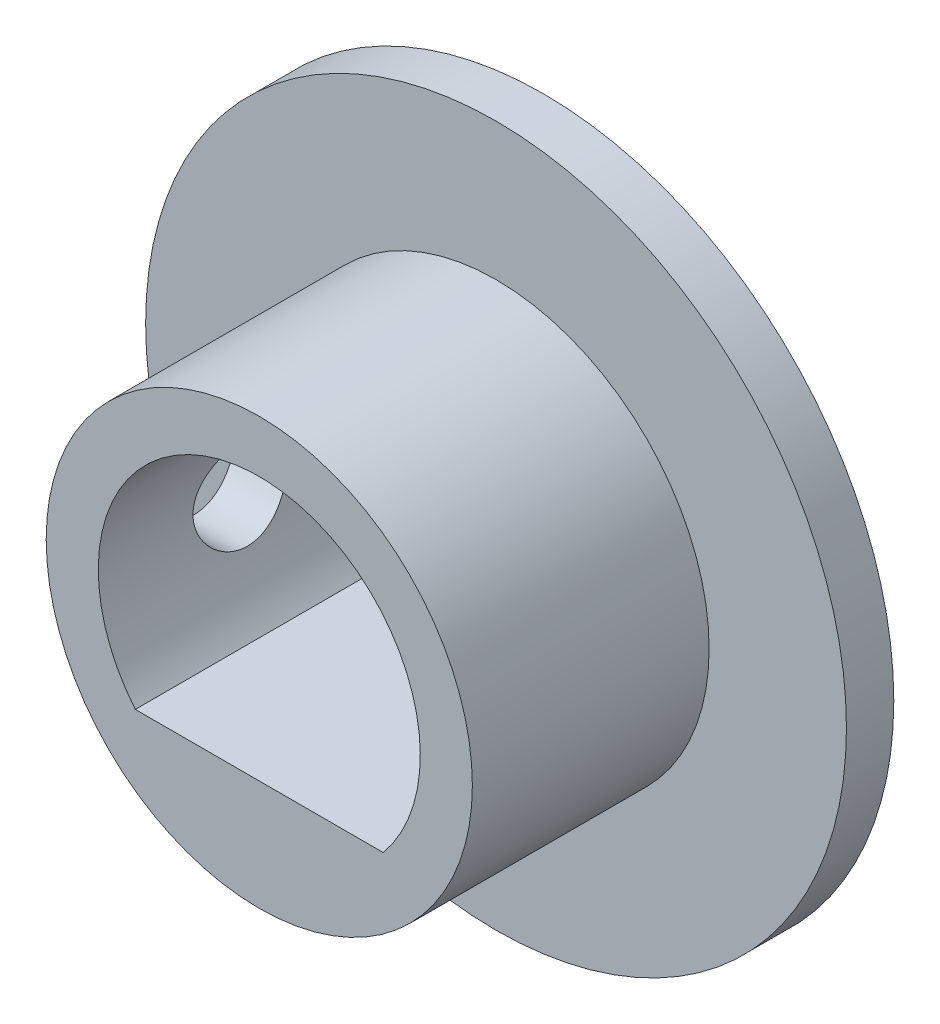
ISO-10303-21;
HEADER;
FILE_DESCRIPTION(('STEP AP214'),'2;1');
FILE_NAME('part.step','',(''),(''),'','','');
FILE_SCHEMA(('AUTOMOTIVE_DESIGN { 1 0 10303 214 1 1 1 1 }'));
ENDSEC;
DATA;
#1=APPLICATION_CONTEXT('core data for automotive mechanical design processes');
#2=APPLICATION_PROTOCOL_DEFINITION('international standard','automotive_design',2000,#1);
#3=PRODUCT_CONTEXT('',#1,'mechanical');
#4=PRODUCT('Part','Part','',(#3));
#5=PRODUCT_RELATED_PRODUCT_CATEGORY('part','',(#4));
#6=PRODUCT_DEFINITION_FORMATION('','',#4);
#7=PRODUCT_DEFINITION_CONTEXT('part definition',#1,'design');
#8=PRODUCT_DEFINITION('design','',#6,#7);
#9=PRODUCT_DEFINITION_SHAPE('','',#8);
#10=(LENGTH_UNIT() NAMED_UNIT(*) SI_UNIT(.MILLI.,.METRE.));
#11=(NAMED_UNIT(*) PLANE_ANGLE_UNIT() SI_UNIT($,.RADIAN.));
#12=(NAMED_UNIT(*) SI_UNIT($,.STERADIAN.) SOLID_ANGLE_UNIT());
#13=UNCERTAINTY_MEASURE_WITH_UNIT(LENGTH_MEASURE(1.E-05),#10,'distance_accuracy_value','');
#14=(GEOMETRIC_REPRESENTATION_CONTEXT(3) GLOBAL_UNCERTAINTY_ASSIGNED_CONTEXT((#13)) GLOBAL_UNIT_ASSIGNED_CONTEXT((#10,
#11,#12)) REPRESENTATION_CONTEXT('',''));
#15=CARTESIAN_POINT('',(0.,0.,0.));
#16=DIRECTION('',(0.,0.,1.));
#17=DIRECTION('',(1.,0.,0.));
#18=AXIS2_PLACEMENT_3D('',#15,#16,#17);
#19=CARTESIAN_POINT('',(-10.,0.,2.));
#20=DIRECTION('',(1.,0.,0.));
#21=DIRECTION('',(0.,0.,-1.));
#22=AXIS2_PLACEMENT_3D('',#19,#20,#21);
#23=CYLINDRICAL_SURFACE('',#22,0.5);
#24=CARTESIAN_POINT('',(-1.70000000000069,0.,1.5));
#25=CARTESIAN_POINT('',(-1.69999972396981,0.0274542175454998,1.50000039810855));
#26=CARTESIAN_POINT('',(-1.69932854758258,0.054912477704873,1.5022687167806));
#27=CARTESIAN_POINT('',(-1.69671658618526,0.109030958051796,1.51126154207209));
#28=CARTESIAN_POINT('',(-1.69477538023207,0.135690910580581,1.51798752616556));
#29=CARTESIAN_POINT('',(-1.68983635138412,0.187424279484835,1.53565283018592));
#30=CARTESIAN_POINT('',(-1.68684005234762,0.212499922780447,1.54658607571816));
#31=CARTESIAN_POINT('',(-1.68010321919066,0.260462027591253,1.57233107143137));
#32=CARTESIAN_POINT('',(-1.67636259475988,0.28334822295742,1.58714329232425));
#33=CARTESIAN_POINT('',(-1.6684211212758,0.326915832232665,1.62065834848709));
#34=CARTESIAN_POINT('',(-1.66421111945033,0.347528005838767,1.63944901914893));
#35=CARTESIAN_POINT('',(-1.65586072964249,0.385358695625953,1.68020027505933));
#36=CARTESIAN_POINT('',(-1.65172035292767,0.402576667261324,1.70216136797423));
#37=CARTESIAN_POINT('',(-1.64388177885663,0.433489560843398,1.74920978849644));
#38=CARTESIAN_POINT('',(-1.64019498875948,0.447100870925724,1.77435413117266));
#39=CARTESIAN_POINT('',(-1.63381741309155,0.469873934282045,1.82670075125634));
#40=CARTESIAN_POINT('',(-1.63112639884003,0.479036709316839,1.85390255443589));
#41=CARTESIAN_POINT('',(-1.62714028106143,0.492404618093305,1.90881628430084));
#42=CARTESIAN_POINT('',(-1.62580942222055,0.496737026528988,1.93649456404589));
#43=CARTESIAN_POINT('',(-1.62458784321419,0.500718547717908,1.99221464004671));
#44=CARTESIAN_POINT('',(-1.6246967892879,0.500368745852888,2.02025635055003));
#45=CARTESIAN_POINT('',(-1.62631076423464,0.495095940847221,2.07488018833094));
#46=CARTESIAN_POINT('',(-1.62776743003588,0.490331354004492,2.10147927130698));
#47=CARTESIAN_POINT('',(-1.63183462131941,0.476619765951321,2.15348255261052));
#48=CARTESIAN_POINT('',(-1.6344452566834,0.46767236644609,2.17888663689454));
#49=CARTESIAN_POINT('',(-1.64056554249258,0.445730211204775,2.22817092913304));
#50=CARTESIAN_POINT('',(-1.64408666355708,0.432683320772064,2.25202644070068));
#51=CARTESIAN_POINT('',(-1.6516255465502,0.402948792079227,2.29726307507329));
#52=CARTESIAN_POINT('',(-1.6556434246939,0.386260301174661,2.31864361659134));
#53=CARTESIAN_POINT('',(-1.66392021053814,0.348925235082879,2.35922317345253));
#54=CARTESIAN_POINT('',(-1.66818232641238,0.328146894888292,2.37830050623496));
#55=CARTESIAN_POINT('',(-1.67632443382187,0.28363291087304,2.41272760278791));
#56=CARTESIAN_POINT('',(-1.68020440312332,0.259897095164163,2.42807714974681));
#57=CARTESIAN_POINT('',(-1.68717818213053,0.209926848756554,2.45468300398081));
#58=CARTESIAN_POINT('',(-1.69026694822818,0.183677785505987,2.4659132390462));
#59=CARTESIAN_POINT('',(-1.69527396107227,0.129551766537361,2.48376420514398));
#60=CARTESIAN_POINT('',(-1.6971925211271,0.101675248742461,2.49038617005146));
#61=CARTESIAN_POINT('',(-1.69959379405195,0.0461208137740008,2.49863217783922));
#62=CARTESIAN_POINT('',(-1.7001238920488,0.0184693998456999,2.50042122697516));
#63=CARTESIAN_POINT('',(-1.69982701770587,-0.0367399044955548,2.49941185344966));
#64=CARTESIAN_POINT('',(-1.69900021882993,-0.0642978064116669,2.49661401716943));
#65=CARTESIAN_POINT('',(-1.69611340455512,-0.117921271346877,2.48664411114999));
#66=CARTESIAN_POINT('',(-1.69408036196296,-0.144006199434007,2.47956765159767));
#67=CARTESIAN_POINT('',(-1.68901536343125,-0.194613518045656,2.46135566461608));
#68=CARTESIAN_POINT('',(-1.68598328919923,-0.219135723122082,2.4502196564907));
#69=CARTESIAN_POINT('',(-1.67915033525374,-0.266534944942125,2.4239224202686));
#70=CARTESIAN_POINT('',(-1.6753336735366,-0.289362448535129,2.40867615717212));
#71=CARTESIAN_POINT('',(-1.66737041365817,-0.332191560315024,2.37469515596717));
#72=CARTESIAN_POINT('',(-1.66322373609983,-0.352192485235586,2.35595957691774));
#73=CARTESIAN_POINT('',(-1.65488725580275,-0.389521688003129,2.31475718567328));
#74=CARTESIAN_POINT('',(-1.65070097598705,-0.406732704570867,2.29218319744675));
#75=CARTESIAN_POINT('',(-1.64291353562876,-0.437129517026455,2.24437672555393));
#76=CARTESIAN_POINT('',(-1.63931235745109,-0.450315434242085,2.21914432205058));
#77=CARTESIAN_POINT('',(-1.63314467441339,-0.472194711731598,2.16682854432189));
#78=CARTESIAN_POINT('',(-1.6305730587306,-0.480910325161373,2.13975511367299));
#79=CARTESIAN_POINT('',(-1.62676658509109,-0.49363492715321,2.08443576832728));
#80=CARTESIAN_POINT('',(-1.62553129148333,-0.497645449646345,2.05619023886352));
#81=CARTESIAN_POINT('',(-1.62457908151666,-0.500744547640744,2.00054324812884));
#82=CARTESIAN_POINT('',(-1.6248033563012,-0.500023747013505,1.9731532671098));
#83=CARTESIAN_POINT('',(-1.62660429813584,-0.494133317252603,1.91890354609242));
#84=CARTESIAN_POINT('',(-1.62818091489141,-0.488963853567801,1.89204378641279));
#85=CARTESIAN_POINT('',(-1.63247022811412,-0.474443717982469,1.83991528209132));
#86=CARTESIAN_POINT('',(-1.63516969306,-0.465141659938631,1.81463182780227));
#87=CARTESIAN_POINT('',(-1.64139857101321,-0.442658103895199,1.76596432278144));
#88=CARTESIAN_POINT('',(-1.64492813798754,-0.42947588609091,1.74258062549968));
#89=CARTESIAN_POINT('',(-1.65257448134245,-0.399063021174092,1.69748709178552));
#90=CARTESIAN_POINT('',(-1.65670754358588,-0.381706300583875,1.6758650444223));
#91=CARTESIAN_POINT('',(-1.66501406548957,-0.343666397752522,1.63577861717299));
#92=CARTESIAN_POINT('',(-1.66918753523427,-0.322982363900053,1.61731504818874));
#93=CARTESIAN_POINT('',(-1.67724327840533,-0.278184131205535,1.58356079177661));
#94=CARTESIAN_POINT('',(-1.68111427331445,-0.253990743219957,1.56837224133486));
#95=CARTESIAN_POINT('',(-1.68799593333913,-0.203279874238697,1.54230015692986));
#96=CARTESIAN_POINT('',(-1.69100702921778,-0.176763565631545,1.53141446641206));
#97=CARTESIAN_POINT('',(-1.6955429771066,-0.125377523319693,1.51531644916826));
#98=CARTESIAN_POINT('',(-1.69720086024169,-0.100680227815031,1.50958791513499));
#99=CARTESIAN_POINT('',(-1.69942941608043,-0.0506563708688417,1.50192979672589));
#100=CARTESIAN_POINT('',(-1.70000025467326,-0.0253299060398251,1.4999996326957));
#101=CARTESIAN_POINT('',(-1.70000000000069,0.,1.5));
#102=B_SPLINE_CURVE_WITH_KNOTS('',3,(#24,#25,#26,#27,#28,#29,#30,#31,#32,#33,#34,#35,#36,#37,
#38,#39,#40,#41,#42,#43,#44,#45,#46,#47,#48,#49,#50,#51,#52,#53,#54,#55,#56,#57,#58,#59,#60,#61,
#62,#63,#64,#65,#66,#67,#68,#69,#70,#71,#72,#73,#74,#75,#76,#77,#78,#79,#80,#81,#82,#83,#84,#85,
#86,#87,#88,#89,#90,#91,#92,#93,#94,#95,#96,#97,#98,#99,#100,#101),.UNSPECIFIED.,.T.,.F.,(4,2,2,
2,2,2,2,2,2,2,2,2,2,2,2,2,2,2,2,2,2,2,2,2,2,2,2,2,2,2,2,2,2,2,2,2,2,2,4),(0.,0.0822696384189309,
0.16456655840143,0.246745102176107,0.328933622904903,0.41317236146188,0.497424603805164,
0.583486437069727,0.669528493878357,0.753245524854036,0.836943149746451,0.917749119380957,
0.998562785070003,1.08044888740713,1.1623541831705,1.24754016451814,1.33273109917883,
1.418452287519,1.50415051497112,1.58688347605599,1.66960586149594,1.75054473049358,
1.83149318667638,1.91426539874687,1.99705758517075,2.08273157599064,2.1684029841012,
2.25364367704803,2.33885657250566,2.42065793646578,2.50245625830796,2.58331682330487,
2.66419239813121,2.74791225511781,2.83165357403022,2.91771614907322,3.00373553547224,
3.07965102255304,3.15555492357038),.UNSPECIFIED.);
#103=CARTESIAN_POINT('',(-1.70000000000069,0.,1.5));
#104=VERTEX_POINT('',#103);
#105=EDGE_CURVE('E66',#104,#104,#102,.T.);
#106=ORIENTED_EDGE('',*,*,#105,.T.);
#107=EDGE_LOOP('',(#106));
#108=FACE_BOUND('',#107,.T.);
#109=CARTESIAN_POINT('',(-2.25,0.,1.5));
#110=CARTESIAN_POINT('',(-2.24999949054563,0.0277201191939123,1.50000093091996));
#111=CARTESIAN_POINT('',(-2.24948253498923,0.0554513913174053,1.50231299541588));
#112=CARTESIAN_POINT('',(-2.24747024439417,0.110125486025784,1.51149011808764));
#113=CARTESIAN_POINT('',(-2.24597422554337,0.137067743784747,1.51835835850232));
#114=CARTESIAN_POINT('',(-2.24217028292252,0.189365819440382,1.53642149262292));
#115=CARTESIAN_POINT('',(-2.23986322109771,0.214723288025071,1.54761179424947));
#116=CARTESIAN_POINT('',(-2.23468583860344,0.263200045078441,1.57398665311811));
#117=CARTESIAN_POINT('',(-2.2318155288684,0.286319376983337,1.58917113282266));
#118=CARTESIAN_POINT('',(-2.22577273543553,0.330046578503509,1.62336891627667));
#119=CARTESIAN_POINT('',(-2.22259640410357,0.350612153010884,1.64243562553379));
#120=CARTESIAN_POINT('',(-2.21632650269947,0.388281227614593,1.68374201502329));
#121=CARTESIAN_POINT('',(-2.21323294022012,0.405384411027139,1.70598198517762));
#122=CARTESIAN_POINT('',(-2.20744082065428,0.435831108525876,1.75331796101458));
#123=CARTESIAN_POINT('',(-2.20474718935745,0.449129355261009,1.77844373951039));
#124=CARTESIAN_POINT('',(-2.20011524088099,0.471298247386271,1.83064319042311));
#125=CARTESIAN_POINT('',(-2.19817683026193,0.48016944055024,1.85771662137607));
#126=CARTESIAN_POINT('',(-2.19531402364797,0.493092145016011,1.91258336933067));
#127=CARTESIAN_POINT('',(-2.19437386451946,0.497218667595172,1.94035817877636));
#128=CARTESIAN_POINT('',(-2.19356668432667,0.500768177494183,1.99622055444655));
#129=CARTESIAN_POINT('',(-2.19369952694735,0.500191762279158,2.02430808049054));
#130=CARTESIAN_POINT('',(-2.19500908037036,0.494412068793255,2.07943915679845));
#131=CARTESIAN_POINT('',(-2.1961660784621,0.489296161150543,2.10649240603484));
#132=CARTESIAN_POINT('',(-2.19936238547919,0.474721226702865,2.15934678583125));
#133=CARTESIAN_POINT('',(-2.20140174533294,0.465261949204129,2.18514784402135));
#134=CARTESIAN_POINT('',(-2.20615227492574,0.442189182182187,2.23500985959547));
#135=CARTESIAN_POINT('',(-2.20886881090622,0.428542298448382,2.25905483183402));
#136=CARTESIAN_POINT('',(-2.21466434477686,0.397505170349624,2.30454571762898));
#137=CARTESIAN_POINT('',(-2.21774339355149,0.380114400185686,2.32599126545504));
#138=CARTESIAN_POINT('',(-2.22400143653166,0.341621709257457,2.36617732733712));
#139=CARTESIAN_POINT('',(-2.22718112671968,0.320445551316558,2.38484669627627));
#140=CARTESIAN_POINT('',(-2.23321959780579,0.275226654522905,2.41838093222678));
#141=CARTESIAN_POINT('',(-2.23607837252107,0.251183860459343,2.43324572594548));
#142=CARTESIAN_POINT('',(-2.24116266058402,0.200825797683684,2.45876731894421));
#143=CARTESIAN_POINT('',(-2.24338673251915,0.174505530579964,2.46941456107707));
#144=CARTESIAN_POINT('',(-2.24694034091564,0.120388982745364,2.48611525326447));
#145=CARTESIAN_POINT('',(-2.24827001174196,0.0925929243983415,2.49216939335354));
#146=CARTESIAN_POINT('',(-2.24986579440418,0.0369238708202113,2.4994080033138));
#147=CARTESIAN_POINT('',(-2.25015312155572,0.00906409932972637,2.50068962504042));
#148=CARTESIAN_POINT('',(-2.24969139662649,-0.0464714809820199,2.49861047393491));
#149=CARTESIAN_POINT('',(-2.24894241722615,-0.0741473025676614,2.49525002667014));
#150=CARTESIAN_POINT('',(-2.24650564689653,-0.128205814332355,2.48406264620798));
#151=CARTESIAN_POINT('',(-2.2448286175194,-0.154599622928871,2.47628688594414));
#152=CARTESIAN_POINT('',(-2.24072355271699,-0.205708201463958,2.45654657813874));
#153=CARTESIAN_POINT('',(-2.23829545191165,-0.230422825002544,2.4445816659235));
#154=CARTESIAN_POINT('',(-2.2329053830691,-0.277871609973595,2.41660178080026));
#155=CARTESIAN_POINT('',(-2.22993611147562,-0.300571432708062,2.40053001424846));
#156=CARTESIAN_POINT('',(-2.2238075808727,-0.34298674124703,2.36486718772464));
#157=CARTESIAN_POINT('',(-2.22064829637544,-0.362701825433532,2.34527565491698));
#158=CARTESIAN_POINT('',(-2.21442219736453,-0.398973870477464,2.30268299160483));
#159=CARTESIAN_POINT('',(-2.21135829416071,-0.415463454850183,2.27962397749835));
#160=CARTESIAN_POINT('',(-2.20573848844577,-0.44433652980688,2.2310069913973));
#161=CARTESIAN_POINT('',(-2.20318256373818,-0.456720199817434,2.20544912866448));
#162=CARTESIAN_POINT('',(-2.19889300137232,-0.476945004740648,2.15269792772372));
#163=CARTESIAN_POINT('',(-2.19715469914947,-0.484811965886897,2.12551488943279));
#164=CARTESIAN_POINT('',(-2.19468912424348,-0.495855069146014,2.07016895378439));
#165=CARTESIAN_POINT('',(-2.19396168386833,-0.49903198929589,2.04200621974352));
#166=CARTESIAN_POINT('',(-2.19361100362244,-0.50057089160261,1.98618028043042));
#167=CARTESIAN_POINT('',(-2.19396324592531,-0.499039782859833,1.95852012298499));
#168=CARTESIAN_POINT('',(-2.19567666239387,-0.491445692804219,1.9038625725083));
#169=CARTESIAN_POINT('',(-2.19703782386758,-0.485382768500599,1.87686517114413));
#170=CARTESIAN_POINT('',(-2.20060357032881,-0.468949549951861,1.82438771994316));
#171=CARTESIAN_POINT('',(-2.20280501295692,-0.458595291571134,1.7989024207796));
#172=CARTESIAN_POINT('',(-2.20780441117264,-0.433886925870855,1.75001500186332));
#173=CARTESIAN_POINT('',(-2.21060243119158,-0.419532386462984,1.726613107509));
#174=CARTESIAN_POINT('',(-2.21655260708832,-0.386878397476395,1.68203084776301));
#175=CARTESIAN_POINT('',(-2.21971092841935,-0.368502963777596,1.66090694876934));
#176=CARTESIAN_POINT('',(-2.22598493543347,-0.32848217648626,1.62200748151717));
#177=CARTESIAN_POINT('',(-2.22910061107263,-0.306836066558359,1.6042326898729));
#178=CARTESIAN_POINT('',(-2.23498814931645,-0.260536492661392,1.57230600427002));
#179=CARTESIAN_POINT('',(-2.23775480874807,-0.235846409158737,1.55820620006627));
#180=CARTESIAN_POINT('',(-2.24258014592312,-0.184390069944705,1.5343791739547));
#181=CARTESIAN_POINT('',(-2.24463940817704,-0.157625550828249,1.52464833998846));
#182=CARTESIAN_POINT('',(-2.24745703227389,-0.109034561932352,1.51153966243081));
#183=CARTESIAN_POINT('',(-2.24840467255803,-0.0874679979754205,1.50722065658343));
#184=CARTESIAN_POINT('',(-2.24967634364947,-0.0439366124736319,1.50145052392347));
#185=CARTESIAN_POINT('',(-2.25000040380903,-0.0219718097232194,1.49999926212453));
#186=CARTESIAN_POINT('',(-2.25,0.,1.5));
#187=B_SPLINE_CURVE_WITH_KNOTS('',3,(#109,#110,#111,#112,#113,#114,#115,#116,#117,#118,#119,
#120,#121,#122,#123,#124,#125,#126,#127,#128,#129,#130,#131,#132,#133,#134,#135,#136,#137,#138,
#139,#140,#141,#142,#143,#144,#145,#146,#147,#148,#149,#150,#151,#152,#153,#154,#155,#156,#157,
#158,#159,#160,#161,#162,#163,#164,#165,#166,#167,#168,#169,#170,#171,#172,#173,#174,#175,#176,
#177,#178,#179,#180,#181,#182,#183,#184,#185,#186),.UNSPECIFIED.,.T.,.F.,(4,2,2,2,2,2,2,2,2,2,2,
2,2,2,2,2,2,2,2,2,2,2,2,2,2,2,2,2,2,2,2,2,2,2,2,2,2,2,4),(0.,0.0830799224324492,
0.166217932812321,0.249267853101865,0.332316161292473,0.416595180005198,0.500881903726285,
0.58613324074494,0.67137402671935,0.755247814095267,0.839110946241477,0.921394170364459,
1.00368214436735,1.08664417427395,1.16961786314575,1.25444544952244,1.33927466992457,
1.42429503202809,1.50930261875497,1.59256998031067,1.67583150228067,1.75814717356292,
1.84047001236365,1.9239995081551,2.00754023346939,2.09267368276432,2.17780341127603,
2.26244139763811,2.34706534171603,2.42978196285604,2.51249754345715,2.59490678003945,
2.67732492146596,2.76146081578206,2.84561619616603,2.93090646762392,3.01612609467734,
3.08198086839639,3.14783254221988),.UNSPECIFIED.);
#188=CARTESIAN_POINT('',(-2.25,0.,1.5));
#189=VERTEX_POINT('',#188);
#190=EDGE_CURVE('E103',#189,#189,#187,.T.);
#191=ORIENTED_EDGE('',*,*,#190,.F.);
#192=EDGE_LOOP('',(#191));
#193=FACE_BOUND('',#192,.T.);
#194=ADVANCED_FACE('F36',(#108,#193),#23,.F.);
#195=CARTESIAN_POINT('',(0.,0.,6.5));
#196=DIRECTION('',(0.,0.,-1.));
#197=DIRECTION('',(-1.,0.,0.));
#198=AXIS2_PLACEMENT_3D('',#195,#196,#197);
#199=CYLINDRICAL_SURFACE('',#198,3.7);
#200=CARTESIAN_POINT('',(0.,0.,1.));
#201=DIRECTION('',(0.,0.,1.));
#202=DIRECTION('',(1.,0.,0.));
#203=AXIS2_PLACEMENT_3D('',#200,#201,#202);
#204=CIRCLE('',#203,3.7);
#205=CARTESIAN_POINT('',(-3.7,0.,0.999999999999999));
#206=VERTEX_POINT('',#205);
#207=EDGE_CURVE('E110',#206,#206,#204,.T.);
#208=CARTESIAN_POINT('',(0.,0.,0.5));
#209=DIRECTION('',(0.,0.,-1.));
#210=DIRECTION('',(-1.,0.,0.));
#211=AXIS2_PLACEMENT_3D('',#208,#209,#210);
#212=CIRCLE('',#211,3.7);
#213=CARTESIAN_POINT('',(-3.7,0.,0.5));
#214=VERTEX_POINT('',#213);
#215=EDGE_CURVE('E109',#214,#214,#212,.T.);
#216=CARTESIAN_POINT('',(-3.7,0.,0.999999999999999));
#217=CARTESIAN_POINT('',(-3.7,0.,0.994791666666666));
#218=CARTESIAN_POINT('',(-3.7,0.,0.989583333333333));
#219=CARTESIAN_POINT('',(-3.7,0.,0.979166666666666));
#220=CARTESIAN_POINT('',(-3.7,0.,0.973958333333332));
#221=CARTESIAN_POINT('',(-3.7,0.,0.963541666666666));
#222=CARTESIAN_POINT('',(-3.7,0.,0.958333333333332));
#223=CARTESIAN_POINT('',(-3.7,0.,0.947916666666666));
#224=CARTESIAN_POINT('',(-3.7,0.,0.942708333333332));
#225=CARTESIAN_POINT('',(-3.7,0.,0.932291666666666));
#226=CARTESIAN_POINT('',(-3.7,0.,0.927083333333332));
#227=CARTESIAN_POINT('',(-3.7,0.,0.916666666666666));
#228=CARTESIAN_POINT('',(-3.7,0.,0.911458333333332));
#229=CARTESIAN_POINT('',(-3.7,0.,0.901041666666666));
#230=CARTESIAN_POINT('',(-3.7,0.,0.895833333333332));
#231=CARTESIAN_POINT('',(-3.7,0.,0.885416666666666));
#232=CARTESIAN_POINT('',(-3.7,0.,0.880208333333332));
#233=CARTESIAN_POINT('',(-3.7,0.,0.869791666666666));
#234=CARTESIAN_POINT('',(-3.7,0.,0.864583333333333));
#235=CARTESIAN_POINT('',(-3.7,0.,0.854166666666667));
#236=CARTESIAN_POINT('',(-3.7,0.,0.848958333333333));
#237=CARTESIAN_POINT('',(-3.7,0.,0.838541666666667));
#238=CARTESIAN_POINT('',(-3.7,0.,0.833333333333333));
#239=CARTESIAN_POINT('',(-3.7,0.,0.822916666666667));
#240=CARTESIAN_POINT('',(-3.7,0.,0.817708333333333));
#241=CARTESIAN_POINT('',(-3.7,0.,0.807291666666667));
#242=CARTESIAN_POINT('',(-3.7,0.,0.802083333333333));
#243=CARTESIAN_POINT('',(-3.7,0.,0.791666666666667));
#244=CARTESIAN_POINT('',(-3.7,0.,0.786458333333333));
#245=CARTESIAN_POINT('',(-3.7,0.,0.776041666666667));
#246=CARTESIAN_POINT('',(-3.7,0.,0.770833333333333));
#247=CARTESIAN_POINT('',(-3.7,0.,0.760416666666667));
#248=CARTESIAN_POINT('',(-3.7,0.,0.755208333333333));
#249=CARTESIAN_POINT('',(-3.7,0.,0.744791666666667));
#250=CARTESIAN_POINT('',(-3.7,0.,0.739583333333333));
#251=CARTESIAN_POINT('',(-3.7,0.,0.729166666666667));
#252=CARTESIAN_POINT('',(-3.7,0.,0.723958333333333));
#253=CARTESIAN_POINT('',(-3.7,0.,0.713541666666667));
#254=CARTESIAN_POINT('',(-3.7,0.,0.708333333333333));
#255=CARTESIAN_POINT('',(-3.7,0.,0.697916666666666));
#256=CARTESIAN_POINT('',(-3.7,0.,0.692708333333333));
#257=CARTESIAN_POINT('',(-3.7,0.,0.682291666666666));
#258=CARTESIAN_POINT('',(-3.7,0.,0.677083333333333));
#259=CARTESIAN_POINT('',(-3.7,0.,0.666666666666666));
#260=CARTESIAN_POINT('',(-3.7,0.,0.661458333333333));
#261=CARTESIAN_POINT('',(-3.7,0.,0.651041666666666));
#262=CARTESIAN_POINT('',(-3.7,0.,0.645833333333333));
#263=CARTESIAN_POINT('',(-3.7,0.,0.635416666666667));
#264=CARTESIAN_POINT('',(-3.7,0.,0.630208333333334));
#265=CARTESIAN_POINT('',(-3.7,0.,0.619791666666667));
#266=CARTESIAN_POINT('',(-3.7,0.,0.614583333333334));
#267=CARTESIAN_POINT('',(-3.7,0.,0.604166666666667));
#268=CARTESIAN_POINT('',(-3.7,0.,0.598958333333334));
#269=CARTESIAN_POINT('',(-3.7,0.,0.588541666666667));
#270=CARTESIAN_POINT('',(-3.7,0.,0.583333333333334));
#271=CARTESIAN_POINT('',(-3.7,0.,0.572916666666667));
#272=CARTESIAN_POINT('',(-3.7,0.,0.567708333333334));
#273=CARTESIAN_POINT('',(-3.7,0.,0.557291666666667));
#274=CARTESIAN_POINT('',(-3.7,0.,0.552083333333334));
#275=CARTESIAN_POINT('',(-3.7,0.,0.541666666666667));
#276=CARTESIAN_POINT('',(-3.7,0.,0.536458333333334));
#277=CARTESIAN_POINT('',(-3.7,0.,0.526041666666667));
#278=CARTESIAN_POINT('',(-3.7,0.,0.520833333333334));
#279=CARTESIAN_POINT('',(-3.7,0.,0.510416666666667));
#280=CARTESIAN_POINT('',(-3.7,0.,0.505208333333334));
#281=CARTESIAN_POINT('',(-3.7,0.,0.5));
#282=B_SPLINE_CURVE_WITH_KNOTS('',3,(#216,#217,#218,#219,#220,#221,#222,#223,#224,#225,#226,
#227,#228,#229,#230,#231,#232,#233,#234,#235,#236,#237,#238,#239,#240,#241,#242,#243,#244,#245,
#246,#247,#248,#249,#250,#251,#252,#253,#254,#255,#256,#257,#258,#259,#260,#261,#262,#263,#264,
#265,#266,#267,#268,#269,#270,#271,#272,#273,#274,#275,#276,#277,#278,#279,#280,#281),
.UNSPECIFIED.,.F.,.F.,(4,2,2,2,2,2,2,2,2,2,2,2,2,2,2,2,2,2,2,2,2,2,2,2,2,2,2,2,2,2,2,2,4),(0.,
0.015625,0.03125,0.046875,0.0625000000000001,0.0781250000000001,0.0937500000000001,0.109375,
0.125,0.140624999999999,0.156249999999999,0.171874999999999,0.187499999999999,0.203124999999999,
0.218749999999999,0.234374999999999,0.249999999999999,0.265624999999999,0.281249999999999,
0.296874999999999,0.312499999999999,0.328124999999999,0.343749999999999,0.359374999999999,
0.374999999999999,0.390624999999999,0.406249999999999,0.421874999999999,0.437499999999999,
0.453124999999999,0.468749999999999,0.484374999999999,0.499999999999999),.UNSPECIFIED.);
#283=EDGE_CURVE('BSEAM38',#206,#214,#282,.T.);
#284=ORIENTED_EDGE('',*,*,#207,.F.);
#285=ORIENTED_EDGE('',*,*,#215,.F.);
#286=ORIENTED_EDGE('',*,*,#283,.T.);
#287=ORIENTED_EDGE('',*,*,#283,.F.);
#288=EDGE_LOOP('',(#284,#286,#285,#287));
#289=FACE_BOUND('',#288,.T.);
#290=ADVANCED_FACE('F38',(#289),#199,.T.);
#291=CARTESIAN_POINT('',(0.,0.,1.));
#292=DIRECTION('',(0.,0.,1.));
#293=DIRECTION('',(1.,0.,0.));
#294=AXIS2_PLACEMENT_3D('',#291,#292,#293);
#295=PLANE('',#294);
#296=ORIENTED_EDGE('',*,*,#207,.T.);
#297=EDGE_LOOP('',(#296));
#298=FACE_BOUND('',#297,.T.);
#299=CARTESIAN_POINT('',(0.,0.,1.));
#300=DIRECTION('',(0.,0.,1.));
#301=DIRECTION('',(1.,0.,0.));
#302=AXIS2_PLACEMENT_3D('',#299,#300,#301);
#303=CIRCLE('',#302,2.25);
#304=CARTESIAN_POINT('',(2.25,0.,1.));
#305=VERTEX_POINT('',#304);
#306=EDGE_CURVE('E86',#305,#305,#303,.F.);
#307=ORIENTED_EDGE('',*,*,#306,.T.);
#308=EDGE_LOOP('',(#307));
#309=FACE_BOUND('',#308,.T.);
#310=ADVANCED_FACE('F119',(#298,#309),#295,.T.);
#311=CARTESIAN_POINT('',(0.,0.,0.5));
#312=DIRECTION('',(0.,0.,-1.));
#313=DIRECTION('',(-1.,0.,0.));
#314=AXIS2_PLACEMENT_3D('',#311,#312,#313);
#315=PLANE('',#314);
#316=CARTESIAN_POINT('',(0.,0.,0.5));
#317=DIRECTION('',(0.,0.,-1.));
#318=DIRECTION('',(-1.,0.,0.));
#319=AXIS2_PLACEMENT_3D('',#316,#317,#318);
#320=CIRCLE('',#319,1.70000000000069);
#321=CARTESIAN_POINT('',(-1.30904906991983,-1.08461538461538,0.5));
#322=VERTEX_POINT('',#321);
#323=CARTESIAN_POINT('',(1.30904906991983,-1.08461538461538,0.5));
#324=VERTEX_POINT('',#323);
#325=EDGE_CURVE('E51',#322,#324,#320,.T.);
#326=ORIENTED_EDGE('',*,*,#325,.F.);
#327=DIRECTION('',(-1.,0.,0.));
#328=VECTOR('',#327,1.);
#329=CARTESIAN_POINT('',(1.30904906991983,-1.08461538461538,0.5));
#330=LINE('',#329,#328);
#331=EDGE_CURVE('E70',#324,#322,#330,.T.);
#332=ORIENTED_EDGE('',*,*,#331,.F.);
#333=EDGE_LOOP('',(#326,#332));
#334=FACE_BOUND('',#333,.T.);
#335=ORIENTED_EDGE('',*,*,#215,.T.);
#336=EDGE_LOOP('',(#335));
#337=FACE_BOUND('',#336,.T.);
#338=ADVANCED_FACE('F74',(#334,#337),#315,.T.);
#339=CARTESIAN_POINT('',(0.,0.,-6.4953318805774));
#340=DIRECTION('',(0.,0.,1.));
#341=DIRECTION('',(1.,0.,0.));
#342=AXIS2_PLACEMENT_3D('',#339,#340,#341);
#343=CYLINDRICAL_SURFACE('',#342,2.25);
#344=CARTESIAN_POINT('',(0.,0.,3.5));
#345=DIRECTION('',(0.,0.,-1.));
#346=DIRECTION('',(-1.,0.,0.));
#347=AXIS2_PLACEMENT_3D('',#344,#345,#346);
#348=CIRCLE('',#347,2.25);
#349=CARTESIAN_POINT('',(-2.25,0.,3.5));
#350=VERTEX_POINT('',#349);
#351=EDGE_CURVE('E85',#350,#350,#348,.F.);
#352=ORIENTED_EDGE('',*,*,#351,.F.);
#353=EDGE_LOOP('',(#352));
#354=FACE_BOUND('',#353,.T.);
#355=ORIENTED_EDGE('',*,*,#306,.F.);
#356=EDGE_LOOP('',(#355));
#357=FACE_BOUND('',#356,.T.);
#358=ORIENTED_EDGE('',*,*,#190,.T.);
#359=EDGE_LOOP('',(#358));
#360=FACE_BOUND('',#359,.T.);
#361=ADVANCED_FACE('F97',(#354,#357,#360),#343,.T.);
#362=CARTESIAN_POINT('',(-5.,-3.30057286981229,3.5));
#363=DIRECTION('',(0.,0.,-1.));
#364=DIRECTION('',(-1.,0.,0.));
#365=AXIS2_PLACEMENT_3D('',#362,#363,#364);
#366=PLANE('',#365);
#367=DIRECTION('',(-1.,0.,0.));
#368=VECTOR('',#367,1.);
#369=CARTESIAN_POINT('',(-5.,-1.08461538461538,3.5));
#370=LINE('',#369,#368);
#371=CARTESIAN_POINT('',(1.30904906991983,-1.08461538461538,3.5));
#372=VERTEX_POINT('',#371);
#373=CARTESIAN_POINT('',(-1.30904906991983,-1.08461538461538,3.5));
#374=VERTEX_POINT('',#373);
#375=EDGE_CURVE('E44',#372,#374,#370,.T.);
#376=ORIENTED_EDGE('',*,*,#375,.T.);
#377=CARTESIAN_POINT('',(0.,0.,3.5));
#378=DIRECTION('',(0.,0.,-1.));
#379=DIRECTION('',(-1.,0.,0.));
#380=AXIS2_PLACEMENT_3D('',#377,#378,#379);
#381=CIRCLE('',#380,1.70000000000069);
#382=EDGE_CURVE('E11',#374,#372,#381,.T.);
#383=ORIENTED_EDGE('',*,*,#382,.T.);
#384=EDGE_LOOP('',(#376,#383));
#385=FACE_BOUND('',#384,.T.);
#386=ORIENTED_EDGE('',*,*,#351,.T.);
#387=EDGE_LOOP('',(#386));
#388=FACE_BOUND('',#387,.T.);
#389=ADVANCED_FACE('F94',(#385,#388),#366,.F.);
#390=CARTESIAN_POINT('',(0.,0.,10.5));
#391=DIRECTION('',(0.,0.,-1.));
#392=DIRECTION('',(-1.,0.,0.));
#393=AXIS2_PLACEMENT_3D('',#390,#391,#392);
#394=CYLINDRICAL_SURFACE('',#393,1.70000000000069);
#395=DIRECTION('',(0.,0.,-1.));
#396=VECTOR('',#395,1.);
#397=CARTESIAN_POINT('',(-1.30904906991983,-1.08461538461538,10.5));
#398=LINE('',#397,#396);
#399=EDGE_CURVE('E58',#374,#322,#398,.T.);
#400=ORIENTED_EDGE('',*,*,#399,.T.);
#401=ORIENTED_EDGE('',*,*,#325,.T.);
#402=DIRECTION('',(0.,0.,-1.));
#403=VECTOR('',#402,1.);
#404=CARTESIAN_POINT('',(1.30904906991983,-1.08461538461538,10.5));
#405=LINE('',#404,#403);
#406=EDGE_CURVE('E67',#372,#324,#405,.T.);
#407=ORIENTED_EDGE('',*,*,#406,.F.);
#408=ORIENTED_EDGE('',*,*,#382,.F.);
#409=EDGE_LOOP('',(#400,#401,#407,#408));
#410=FACE_BOUND('',#409,.T.);
#411=ORIENTED_EDGE('',*,*,#105,.F.);
#412=EDGE_LOOP('',(#411));
#413=FACE_BOUND('',#412,.T.);
#414=ADVANCED_FACE('F63',(#410,#413),#394,.F.);
#415=CARTESIAN_POINT('',(1.30904906991983,-1.08461538461538,10.5));
#416=DIRECTION('',(0.,-1.,0.));
#417=DIRECTION('',(0.,0.,-1.));
#418=AXIS2_PLACEMENT_3D('',#415,#416,#417);
#419=PLANE('',#418);
#420=ORIENTED_EDGE('',*,*,#406,.T.);
#421=ORIENTED_EDGE('',*,*,#331,.T.);
#422=ORIENTED_EDGE('',*,*,#399,.F.);
#423=ORIENTED_EDGE('',*,*,#375,.F.);
#424=EDGE_LOOP('',(#420,#421,#422,#423));
#425=FACE_BOUND('',#424,.T.);
#426=ADVANCED_FACE('F71',(#425),#419,.F.);
#427=CLOSED_SHELL('',(#194,#290,#310,#338,#361,#389,#414,#426));
#428=MANIFOLD_SOLID_BREP('B2',#427);
#429=ADVANCED_BREP_SHAPE_REPRESENTATION('',(#18,#428),#14);
#430=SHAPE_DEFINITION_REPRESENTATION(#9,#429);
ENDSEC;
END-ISO-10303-21;
